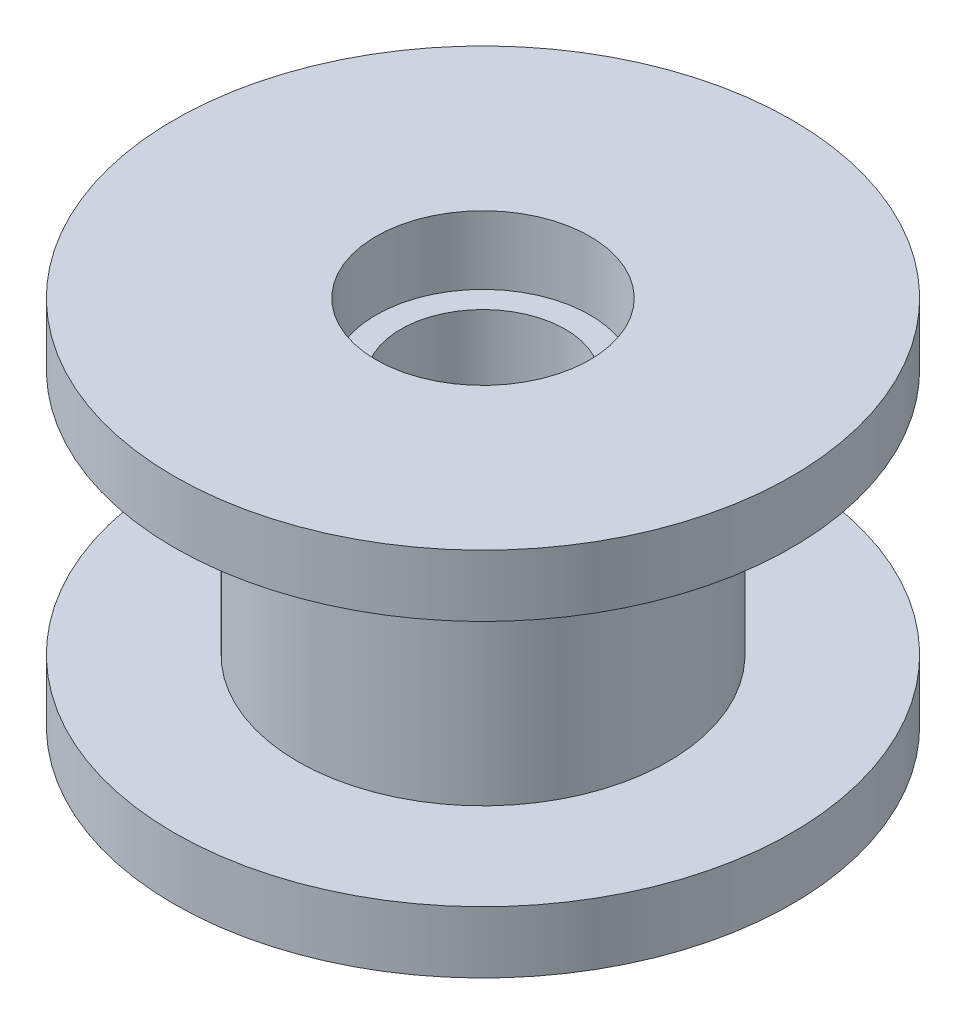
ISO-10303-21;
HEADER;
FILE_DESCRIPTION(('STEP AP214'),'2;1');
FILE_NAME('part.step','',(''),(''),'','','');
FILE_SCHEMA(('AUTOMOTIVE_DESIGN { 1 0 10303 214 1 1 1 1 }'));
ENDSEC;
DATA;
#1=APPLICATION_CONTEXT('core data for automotive mechanical design processes');
#2=APPLICATION_PROTOCOL_DEFINITION('international standard','automotive_design',2000,#1);
#3=PRODUCT_CONTEXT('',#1,'mechanical');
#4=PRODUCT('Part','Part','',(#3));
#5=PRODUCT_RELATED_PRODUCT_CATEGORY('part','',(#4));
#6=PRODUCT_DEFINITION_FORMATION('','',#4);
#7=PRODUCT_DEFINITION_CONTEXT('part definition',#1,'design');
#8=PRODUCT_DEFINITION('design','',#6,#7);
#9=PRODUCT_DEFINITION_SHAPE('','',#8);
#10=(LENGTH_UNIT() NAMED_UNIT(*) SI_UNIT(.MILLI.,.METRE.));
#11=(NAMED_UNIT(*) PLANE_ANGLE_UNIT() SI_UNIT($,.RADIAN.));
#12=(NAMED_UNIT(*) SI_UNIT($,.STERADIAN.) SOLID_ANGLE_UNIT());
#13=UNCERTAINTY_MEASURE_WITH_UNIT(LENGTH_MEASURE(1.E-05),#10,'distance_accuracy_value','');
#14=(GEOMETRIC_REPRESENTATION_CONTEXT(3) GLOBAL_UNCERTAINTY_ASSIGNED_CONTEXT((#13)) GLOBAL_UNIT_ASSIGNED_CONTEXT((#10,
#11,#12)) REPRESENTATION_CONTEXT('',''));
#15=CARTESIAN_POINT('',(0.,0.,0.));
#16=DIRECTION('',(0.,0.,1.));
#17=DIRECTION('',(1.,0.,0.));
#18=AXIS2_PLACEMENT_3D('',#15,#16,#17);
#19=CARTESIAN_POINT('',(0.,-19.05,0.));
#20=DIRECTION('',(0.,1.,0.));
#21=DIRECTION('',(0.,0.,1.));
#22=AXIS2_PLACEMENT_3D('',#19,#20,#21);
#23=CYLINDRICAL_SURFACE('',#22,11.);
#24=CARTESIAN_POINT('',(0.,-19.05,0.));
#25=DIRECTION('',(0.,1.,0.));
#26=DIRECTION('',(0.,0.,1.));
#27=AXIS2_PLACEMENT_3D('',#24,#25,#26);
#28=CIRCLE('',#27,11.);
#29=CARTESIAN_POINT('',(0.,-19.05,11.));
#30=VERTEX_POINT('',#29);
#31=EDGE_CURVE('E88',#30,#30,#28,.T.);
#32=CARTESIAN_POINT('',(0.,-12.05,0.));
#33=DIRECTION('',(0.,1.,0.));
#34=DIRECTION('',(0.,0.,1.));
#35=AXIS2_PLACEMENT_3D('',#32,#33,#34);
#36=CIRCLE('',#35,11.);
#37=CARTESIAN_POINT('',(0.,-12.05,11.));
#38=VERTEX_POINT('',#37);
#39=EDGE_CURVE('E11',#38,#38,#36,.F.);
#40=CARTESIAN_POINT('',(0.,-19.05,11.));
#41=CARTESIAN_POINT('',(0.,-18.9770833333333,11.));
#42=CARTESIAN_POINT('',(0.,-18.9041666666667,11.));
#43=CARTESIAN_POINT('',(0.,-18.7583333333333,11.));
#44=CARTESIAN_POINT('',(0.,-18.6854166666667,11.));
#45=CARTESIAN_POINT('',(0.,-18.5395833333333,11.));
#46=CARTESIAN_POINT('',(0.,-18.4666666666667,11.));
#47=CARTESIAN_POINT('',(0.,-18.3208333333333,11.));
#48=CARTESIAN_POINT('',(0.,-18.2479166666667,11.));
#49=CARTESIAN_POINT('',(0.,-18.1020833333333,11.));
#50=CARTESIAN_POINT('',(0.,-18.0291666666667,11.));
#51=CARTESIAN_POINT('',(0.,-17.8833333333333,11.));
#52=CARTESIAN_POINT('',(0.,-17.8104166666667,11.));
#53=CARTESIAN_POINT('',(0.,-17.6645833333333,11.));
#54=CARTESIAN_POINT('',(0.,-17.5916666666667,11.));
#55=CARTESIAN_POINT('',(0.,-17.4458333333333,11.));
#56=CARTESIAN_POINT('',(0.,-17.3729166666667,11.));
#57=CARTESIAN_POINT('',(0.,-17.2270833333333,11.));
#58=CARTESIAN_POINT('',(0.,-17.1541666666667,11.));
#59=CARTESIAN_POINT('',(0.,-17.0083333333333,11.));
#60=CARTESIAN_POINT('',(0.,-16.9354166666667,11.));
#61=CARTESIAN_POINT('',(0.,-16.7895833333333,11.));
#62=CARTESIAN_POINT('',(0.,-16.7166666666667,11.));
#63=CARTESIAN_POINT('',(0.,-16.5708333333333,11.));
#64=CARTESIAN_POINT('',(0.,-16.4979166666667,11.));
#65=CARTESIAN_POINT('',(0.,-16.3520833333333,11.));
#66=CARTESIAN_POINT('',(0.,-16.2791666666667,11.));
#67=CARTESIAN_POINT('',(0.,-16.1333333333333,11.));
#68=CARTESIAN_POINT('',(0.,-16.0604166666667,11.));
#69=CARTESIAN_POINT('',(0.,-15.9145833333333,11.));
#70=CARTESIAN_POINT('',(0.,-15.8416666666667,11.));
#71=CARTESIAN_POINT('',(0.,-15.6958333333333,11.));
#72=CARTESIAN_POINT('',(0.,-15.6229166666667,11.));
#73=CARTESIAN_POINT('',(0.,-15.4770833333333,11.));
#74=CARTESIAN_POINT('',(0.,-15.4041666666667,11.));
#75=CARTESIAN_POINT('',(0.,-15.2583333333333,11.));
#76=CARTESIAN_POINT('',(0.,-15.1854166666667,11.));
#77=CARTESIAN_POINT('',(0.,-15.0395833333333,11.));
#78=CARTESIAN_POINT('',(0.,-14.9666666666667,11.));
#79=CARTESIAN_POINT('',(0.,-14.8208333333333,11.));
#80=CARTESIAN_POINT('',(0.,-14.7479166666667,11.));
#81=CARTESIAN_POINT('',(0.,-14.6020833333333,11.));
#82=CARTESIAN_POINT('',(0.,-14.5291666666667,11.));
#83=CARTESIAN_POINT('',(0.,-14.3833333333333,11.));
#84=CARTESIAN_POINT('',(0.,-14.3104166666667,11.));
#85=CARTESIAN_POINT('',(0.,-14.1645833333333,11.));
#86=CARTESIAN_POINT('',(0.,-14.0916666666667,11.));
#87=CARTESIAN_POINT('',(0.,-13.9458333333333,11.));
#88=CARTESIAN_POINT('',(0.,-13.8729166666667,11.));
#89=CARTESIAN_POINT('',(0.,-13.7270833333333,11.));
#90=CARTESIAN_POINT('',(0.,-13.6541666666667,11.));
#91=CARTESIAN_POINT('',(0.,-13.5083333333333,11.));
#92=CARTESIAN_POINT('',(0.,-13.4354166666667,11.));
#93=CARTESIAN_POINT('',(0.,-13.2895833333333,11.));
#94=CARTESIAN_POINT('',(0.,-13.2166666666667,11.));
#95=CARTESIAN_POINT('',(0.,-13.0708333333333,11.));
#96=CARTESIAN_POINT('',(0.,-12.9979166666667,11.));
#97=CARTESIAN_POINT('',(0.,-12.8520833333333,11.));
#98=CARTESIAN_POINT('',(0.,-12.7791666666667,11.));
#99=CARTESIAN_POINT('',(0.,-12.6333333333333,11.));
#100=CARTESIAN_POINT('',(0.,-12.5604166666667,11.));
#101=CARTESIAN_POINT('',(0.,-12.4145833333333,11.));
#102=CARTESIAN_POINT('',(0.,-12.3416666666667,11.));
#103=CARTESIAN_POINT('',(0.,-12.1958333333333,11.));
#104=CARTESIAN_POINT('',(0.,-12.1229166666667,11.));
#105=CARTESIAN_POINT('',(0.,-12.05,11.));
#106=B_SPLINE_CURVE_WITH_KNOTS('',3,(#40,#41,#42,#43,#44,#45,#46,#47,#48,#49,#50,#51,#52,#53,
#54,#55,#56,#57,#58,#59,#60,#61,#62,#63,#64,#65,#66,#67,#68,#69,#70,#71,#72,#73,#74,#75,#76,#77,
#78,#79,#80,#81,#82,#83,#84,#85,#86,#87,#88,#89,#90,#91,#92,#93,#94,#95,#96,#97,#98,#99,#100,
#101,#102,#103,#104,#105),.UNSPECIFIED.,.F.,.F.,(4,2,2,2,2,2,2,2,2,2,2,2,2,2,2,2,2,2,2,2,2,2,2,
2,2,2,2,2,2,2,2,2,4),(0.,0.218749999999997,0.437499999999997,0.656249999999997,
0.874999999999997,1.09375,1.3125,1.53125,1.75,1.96875,2.1875,2.40625,2.625,2.84375,3.0625,
3.28125,3.5,3.71875,3.9375,4.15625,4.375,4.59375,4.8125,5.03125,5.25,5.46875,5.6875,5.90625,
6.125,6.34375,6.5625,6.78125,7.),.UNSPECIFIED.);
#107=EDGE_CURVE('BSEAM55',#30,#38,#106,.T.);
#108=ORIENTED_EDGE('',*,*,#31,.F.);
#109=ORIENTED_EDGE('',*,*,#39,.F.);
#110=ORIENTED_EDGE('',*,*,#107,.T.);
#111=ORIENTED_EDGE('',*,*,#107,.F.);
#112=EDGE_LOOP('',(#108,#110,#109,#111));
#113=FACE_BOUND('',#112,.T.);
#114=ADVANCED_FACE('F55',(#113),#23,.F.);
#115=CARTESIAN_POINT('',(0.,19.05,0.));
#116=DIRECTION('',(0.,-1.,0.));
#117=DIRECTION('',(0.,0.,-1.));
#118=AXIS2_PLACEMENT_3D('',#115,#116,#117);
#119=CYLINDRICAL_SURFACE('',#118,31.75);
#120=CARTESIAN_POINT('',(0.,-19.05,0.));
#121=DIRECTION('',(0.,1.,0.));
#122=DIRECTION('',(0.,0.,1.));
#123=AXIS2_PLACEMENT_3D('',#120,#121,#122);
#124=CIRCLE('',#123,31.75);
#125=CARTESIAN_POINT('',(0.,-19.05,-31.75));
#126=VERTEX_POINT('',#125);
#127=EDGE_CURVE('E68',#126,#126,#124,.T.);
#128=CARTESIAN_POINT('',(0.,-12.7,0.));
#129=DIRECTION('',(0.,1.,0.));
#130=DIRECTION('',(1.,0.,0.));
#131=AXIS2_PLACEMENT_3D('',#128,#129,#130);
#132=CIRCLE('',#131,31.75);
#133=CARTESIAN_POINT('',(0.,-12.7,-31.75));
#134=VERTEX_POINT('',#133);
#135=EDGE_CURVE('E74',#134,#134,#132,.T.);
#136=CARTESIAN_POINT('',(0.,-19.05,-31.75));
#137=CARTESIAN_POINT('',(0.,-18.9838541666667,-31.75));
#138=CARTESIAN_POINT('',(0.,-18.9177083333333,-31.75));
#139=CARTESIAN_POINT('',(0.,-18.7854166666667,-31.75));
#140=CARTESIAN_POINT('',(0.,-18.7192708333333,-31.75));
#141=CARTESIAN_POINT('',(0.,-18.5869791666667,-31.75));
#142=CARTESIAN_POINT('',(0.,-18.5208333333333,-31.75));
#143=CARTESIAN_POINT('',(0.,-18.3885416666667,-31.75));
#144=CARTESIAN_POINT('',(0.,-18.3223958333333,-31.75));
#145=CARTESIAN_POINT('',(0.,-18.1901041666667,-31.75));
#146=CARTESIAN_POINT('',(0.,-18.1239583333333,-31.75));
#147=CARTESIAN_POINT('',(0.,-17.9916666666667,-31.75));
#148=CARTESIAN_POINT('',(0.,-17.9255208333333,-31.75));
#149=CARTESIAN_POINT('',(0.,-17.7932291666667,-31.75));
#150=CARTESIAN_POINT('',(0.,-17.7270833333333,-31.75));
#151=CARTESIAN_POINT('',(0.,-17.5947916666667,-31.75));
#152=CARTESIAN_POINT('',(0.,-17.5286458333333,-31.75));
#153=CARTESIAN_POINT('',(0.,-17.3963541666667,-31.75));
#154=CARTESIAN_POINT('',(0.,-17.3302083333333,-31.75));
#155=CARTESIAN_POINT('',(0.,-17.1979166666667,-31.75));
#156=CARTESIAN_POINT('',(0.,-17.1317708333333,-31.75));
#157=CARTESIAN_POINT('',(0.,-16.9994791666667,-31.75));
#158=CARTESIAN_POINT('',(0.,-16.9333333333333,-31.75));
#159=CARTESIAN_POINT('',(0.,-16.8010416666667,-31.75));
#160=CARTESIAN_POINT('',(0.,-16.7348958333333,-31.75));
#161=CARTESIAN_POINT('',(0.,-16.6026041666667,-31.75));
#162=CARTESIAN_POINT('',(0.,-16.5364583333333,-31.75));
#163=CARTESIAN_POINT('',(0.,-16.4041666666667,-31.75));
#164=CARTESIAN_POINT('',(0.,-16.3380208333333,-31.75));
#165=CARTESIAN_POINT('',(0.,-16.2057291666667,-31.75));
#166=CARTESIAN_POINT('',(0.,-16.1395833333333,-31.75));
#167=CARTESIAN_POINT('',(0.,-16.0072916666667,-31.75));
#168=CARTESIAN_POINT('',(0.,-15.9411458333333,-31.75));
#169=CARTESIAN_POINT('',(0.,-15.8088541666667,-31.75));
#170=CARTESIAN_POINT('',(0.,-15.7427083333333,-31.75));
#171=CARTESIAN_POINT('',(0.,-15.6104166666667,-31.75));
#172=CARTESIAN_POINT('',(0.,-15.5442708333333,-31.75));
#173=CARTESIAN_POINT('',(0.,-15.4119791666667,-31.75));
#174=CARTESIAN_POINT('',(0.,-15.3458333333333,-31.75));
#175=CARTESIAN_POINT('',(0.,-15.2135416666667,-31.75));
#176=CARTESIAN_POINT('',(0.,-15.1473958333333,-31.75));
#177=CARTESIAN_POINT('',(0.,-15.0151041666667,-31.75));
#178=CARTESIAN_POINT('',(0.,-14.9489583333333,-31.75));
#179=CARTESIAN_POINT('',(0.,-14.8166666666667,-31.75));
#180=CARTESIAN_POINT('',(0.,-14.7505208333333,-31.75));
#181=CARTESIAN_POINT('',(0.,-14.6182291666667,-31.75));
#182=CARTESIAN_POINT('',(0.,-14.5520833333333,-31.75));
#183=CARTESIAN_POINT('',(0.,-14.4197916666667,-31.75));
#184=CARTESIAN_POINT('',(0.,-14.3536458333333,-31.75));
#185=CARTESIAN_POINT('',(0.,-14.2213541666667,-31.75));
#186=CARTESIAN_POINT('',(0.,-14.1552083333333,-31.75));
#187=CARTESIAN_POINT('',(0.,-14.0229166666667,-31.75));
#188=CARTESIAN_POINT('',(0.,-13.9567708333333,-31.75));
#189=CARTESIAN_POINT('',(0.,-13.8244791666667,-31.75));
#190=CARTESIAN_POINT('',(0.,-13.7583333333333,-31.75));
#191=CARTESIAN_POINT('',(0.,-13.6260416666667,-31.75));
#192=CARTESIAN_POINT('',(0.,-13.5598958333333,-31.75));
#193=CARTESIAN_POINT('',(0.,-13.4276041666667,-31.75));
#194=CARTESIAN_POINT('',(0.,-13.3614583333333,-31.75));
#195=CARTESIAN_POINT('',(0.,-13.2291666666667,-31.75));
#196=CARTESIAN_POINT('',(0.,-13.1630208333333,-31.75));
#197=CARTESIAN_POINT('',(0.,-13.0307291666667,-31.75));
#198=CARTESIAN_POINT('',(0.,-12.9645833333333,-31.75));
#199=CARTESIAN_POINT('',(0.,-12.8322916666667,-31.75));
#200=CARTESIAN_POINT('',(0.,-12.7661458333333,-31.75));
#201=CARTESIAN_POINT('',(0.,-12.7,-31.75));
#202=B_SPLINE_CURVE_WITH_KNOTS('',3,(#136,#137,#138,#139,#140,#141,#142,#143,#144,#145,#146,
#147,#148,#149,#150,#151,#152,#153,#154,#155,#156,#157,#158,#159,#160,#161,#162,#163,#164,#165,
#166,#167,#168,#169,#170,#171,#172,#173,#174,#175,#176,#177,#178,#179,#180,#181,#182,#183,#184,
#185,#186,#187,#188,#189,#190,#191,#192,#193,#194,#195,#196,#197,#198,#199,#200,#201),
.UNSPECIFIED.,.F.,.F.,(4,2,2,2,2,2,2,2,2,2,2,2,2,2,2,2,2,2,2,2,2,2,2,2,2,2,2,2,2,2,2,2,4),(0.,
0.198437500000002,0.396874999999998,0.5953125,0.793749999999996,0.992187499999998,1.190625,
1.3890625,1.5875,1.7859375,1.984375,2.1828125,2.38125,2.5796875,2.778125,2.97656249999999,3.175,
3.3734375,3.571875,3.7703125,3.96874999999999,4.1671875,4.365625,4.56406249999999,4.7625,
4.9609375,5.15937499999999,5.3578125,5.55625,5.75468749999999,5.953125,6.15156249999999,
6.34999999999999),.UNSPECIFIED.);
#203=EDGE_CURVE('BSEAM130',#126,#134,#202,.T.);
#204=ORIENTED_EDGE('',*,*,#127,.T.);
#205=ORIENTED_EDGE('',*,*,#135,.F.);
#206=ORIENTED_EDGE('',*,*,#203,.T.);
#207=ORIENTED_EDGE('',*,*,#203,.F.);
#208=EDGE_LOOP('',(#204,#206,#205,#207));
#209=FACE_BOUND('',#208,.T.);
#210=ADVANCED_FACE('F130',(#209),#119,.T.);
#211=CARTESIAN_POINT('',(0.,-19.05,0.));
#212=DIRECTION('',(0.,1.,0.));
#213=DIRECTION('',(0.,0.,1.));
#214=AXIS2_PLACEMENT_3D('',#211,#212,#213);
#215=PLANE('',#214);
#216=ORIENTED_EDGE('',*,*,#31,.T.);
#217=EDGE_LOOP('',(#216));
#218=FACE_BOUND('',#217,.T.);
#219=ORIENTED_EDGE('',*,*,#127,.F.);
#220=EDGE_LOOP('',(#219));
#221=FACE_BOUND('',#220,.T.);
#222=ADVANCED_FACE('F136',(#218,#221),#215,.F.);
#223=CARTESIAN_POINT('',(0.,-12.7,0.));
#224=DIRECTION('',(0.,1.,0.));
#225=DIRECTION('',(0.,0.,1.));
#226=AXIS2_PLACEMENT_3D('',#223,#224,#225);
#227=PLANE('',#226);
#228=CARTESIAN_POINT('',(0.,-12.7,0.));
#229=DIRECTION('',(0.,1.,0.));
#230=DIRECTION('',(0.,0.,1.));
#231=AXIS2_PLACEMENT_3D('',#228,#229,#230);
#232=CIRCLE('',#231,19.05);
#233=CARTESIAN_POINT('',(0.,-12.7,19.05));
#234=VERTEX_POINT('',#233);
#235=EDGE_CURVE('E80',#234,#234,#232,.T.);
#236=ORIENTED_EDGE('',*,*,#235,.F.);
#237=EDGE_LOOP('',(#236));
#238=FACE_BOUND('',#237,.T.);
#239=ORIENTED_EDGE('',*,*,#135,.T.);
#240=EDGE_LOOP('',(#239));
#241=FACE_BOUND('',#240,.T.);
#242=ADVANCED_FACE('F147',(#238,#241),#227,.T.);
#243=CARTESIAN_POINT('',(0.,12.7,0.));
#244=DIRECTION('',(0.,1.,0.));
#245=DIRECTION('',(0.,0.,1.));
#246=AXIS2_PLACEMENT_3D('',#243,#244,#245);
#247=PLANE('',#246);
#248=CARTESIAN_POINT('',(0.,12.7,0.));
#249=DIRECTION('',(0.,1.,0.));
#250=DIRECTION('',(0.,0.,1.));
#251=AXIS2_PLACEMENT_3D('',#248,#249,#250);
#252=CIRCLE('',#251,19.05);
#253=CARTESIAN_POINT('',(0.,12.7,19.05));
#254=VERTEX_POINT('',#253);
#255=EDGE_CURVE('E84',#254,#254,#252,.T.);
#256=ORIENTED_EDGE('',*,*,#255,.T.);
#257=EDGE_LOOP('',(#256));
#258=FACE_BOUND('',#257,.T.);
#259=CARTESIAN_POINT('',(0.,12.7,0.));
#260=DIRECTION('',(0.,1.,0.));
#261=DIRECTION('',(1.,0.,0.));
#262=AXIS2_PLACEMENT_3D('',#259,#260,#261);
#263=CIRCLE('',#262,31.75);
#264=CARTESIAN_POINT('',(0.,12.7,-31.75));
#265=VERTEX_POINT('',#264);
#266=EDGE_CURVE('E76',#265,#265,#263,.T.);
#267=ORIENTED_EDGE('',*,*,#266,.F.);
#268=EDGE_LOOP('',(#267));
#269=FACE_BOUND('',#268,.T.);
#270=ADVANCED_FACE('F145',(#258,#269),#247,.F.);
#271=CARTESIAN_POINT('',(0.,-12.7,0.));
#272=DIRECTION('',(0.,1.,0.));
#273=DIRECTION('',(0.,0.,1.));
#274=AXIS2_PLACEMENT_3D('',#271,#272,#273);
#275=CYLINDRICAL_SURFACE('',#274,19.05);
#276=ORIENTED_EDGE('',*,*,#235,.T.);
#277=EDGE_LOOP('',(#276));
#278=FACE_BOUND('',#277,.T.);
#279=ORIENTED_EDGE('',*,*,#255,.F.);
#280=EDGE_LOOP('',(#279));
#281=FACE_BOUND('',#280,.T.);
#282=ADVANCED_FACE('F141',(#278,#281),#275,.T.);
#283=CARTESIAN_POINT('',(0.,19.05,0.));
#284=DIRECTION('',(0.,1.,0.));
#285=DIRECTION('',(0.,0.,1.));
#286=AXIS2_PLACEMENT_3D('',#283,#284,#285);
#287=PLANE('',#286);
#288=CARTESIAN_POINT('',(0.,19.05,0.));
#289=DIRECTION('',(0.,1.,0.));
#290=DIRECTION('',(0.,0.,1.));
#291=AXIS2_PLACEMENT_3D('',#288,#289,#290);
#292=CIRCLE('',#291,11.);
#293=CARTESIAN_POINT('',(0.,19.05,11.));
#294=VERTEX_POINT('',#293);
#295=EDGE_CURVE('E95',#294,#294,#292,.T.);
#296=ORIENTED_EDGE('',*,*,#295,.F.);
#297=EDGE_LOOP('',(#296));
#298=FACE_BOUND('',#297,.T.);
#299=CARTESIAN_POINT('',(0.,19.05,0.));
#300=DIRECTION('',(0.,1.,0.));
#301=DIRECTION('',(0.,0.,1.));
#302=AXIS2_PLACEMENT_3D('',#299,#300,#301);
#303=CIRCLE('',#302,31.75);
#304=CARTESIAN_POINT('',(0.,19.05,-31.75));
#305=VERTEX_POINT('',#304);
#306=EDGE_CURVE('E63',#305,#305,#303,.T.);
#307=ORIENTED_EDGE('',*,*,#306,.T.);
#308=EDGE_LOOP('',(#307));
#309=FACE_BOUND('',#308,.T.);
#310=ADVANCED_FACE('F144',(#298,#309),#287,.T.);
#311=CARTESIAN_POINT('',(0.,12.7,-31.75));
#312=CARTESIAN_POINT('',(0.,12.7661458333333,-31.75));
#313=CARTESIAN_POINT('',(0.,12.8322916666667,-31.75));
#314=CARTESIAN_POINT('',(0.,12.9645833333333,-31.75));
#315=CARTESIAN_POINT('',(0.,13.0307291666667,-31.75));
#316=CARTESIAN_POINT('',(0.,13.1630208333333,-31.75));
#317=CARTESIAN_POINT('',(0.,13.2291666666667,-31.75));
#318=CARTESIAN_POINT('',(0.,13.3614583333333,-31.75));
#319=CARTESIAN_POINT('',(0.,13.4276041666667,-31.75));
#320=CARTESIAN_POINT('',(0.,13.5598958333333,-31.75));
#321=CARTESIAN_POINT('',(0.,13.6260416666667,-31.75));
#322=CARTESIAN_POINT('',(0.,13.7583333333333,-31.75));
#323=CARTESIAN_POINT('',(0.,13.8244791666667,-31.75));
#324=CARTESIAN_POINT('',(0.,13.9567708333333,-31.75));
#325=CARTESIAN_POINT('',(0.,14.0229166666667,-31.75));
#326=CARTESIAN_POINT('',(0.,14.1552083333333,-31.75));
#327=CARTESIAN_POINT('',(0.,14.2213541666667,-31.75));
#328=CARTESIAN_POINT('',(0.,14.3536458333333,-31.75));
#329=CARTESIAN_POINT('',(0.,14.4197916666667,-31.75));
#330=CARTESIAN_POINT('',(0.,14.5520833333333,-31.75));
#331=CARTESIAN_POINT('',(0.,14.6182291666667,-31.75));
#332=CARTESIAN_POINT('',(0.,14.7505208333333,-31.75));
#333=CARTESIAN_POINT('',(0.,14.8166666666667,-31.75));
#334=CARTESIAN_POINT('',(0.,14.9489583333333,-31.75));
#335=CARTESIAN_POINT('',(0.,15.0151041666667,-31.75));
#336=CARTESIAN_POINT('',(0.,15.1473958333333,-31.75));
#337=CARTESIAN_POINT('',(0.,15.2135416666667,-31.75));
#338=CARTESIAN_POINT('',(0.,15.3458333333333,-31.75));
#339=CARTESIAN_POINT('',(0.,15.4119791666667,-31.75));
#340=CARTESIAN_POINT('',(0.,15.5442708333333,-31.75));
#341=CARTESIAN_POINT('',(0.,15.6104166666667,-31.75));
#342=CARTESIAN_POINT('',(0.,15.7427083333333,-31.75));
#343=CARTESIAN_POINT('',(0.,15.8088541666667,-31.75));
#344=CARTESIAN_POINT('',(0.,15.9411458333333,-31.75));
#345=CARTESIAN_POINT('',(0.,16.0072916666667,-31.75));
#346=CARTESIAN_POINT('',(0.,16.1395833333333,-31.75));
#347=CARTESIAN_POINT('',(0.,16.2057291666667,-31.75));
#348=CARTESIAN_POINT('',(0.,16.3380208333333,-31.75));
#349=CARTESIAN_POINT('',(0.,16.4041666666667,-31.75));
#350=CARTESIAN_POINT('',(0.,16.5364583333333,-31.75));
#351=CARTESIAN_POINT('',(0.,16.6026041666667,-31.75));
#352=CARTESIAN_POINT('',(0.,16.7348958333333,-31.75));
#353=CARTESIAN_POINT('',(0.,16.8010416666667,-31.75));
#354=CARTESIAN_POINT('',(0.,16.9333333333333,-31.75));
#355=CARTESIAN_POINT('',(0.,16.9994791666667,-31.75));
#356=CARTESIAN_POINT('',(0.,17.1317708333333,-31.75));
#357=CARTESIAN_POINT('',(0.,17.1979166666667,-31.75));
#358=CARTESIAN_POINT('',(0.,17.3302083333333,-31.75));
#359=CARTESIAN_POINT('',(0.,17.3963541666667,-31.75));
#360=CARTESIAN_POINT('',(0.,17.5286458333333,-31.75));
#361=CARTESIAN_POINT('',(0.,17.5947916666667,-31.75));
#362=CARTESIAN_POINT('',(0.,17.7270833333333,-31.75));
#363=CARTESIAN_POINT('',(0.,17.7932291666667,-31.75));
#364=CARTESIAN_POINT('',(0.,17.9255208333333,-31.75));
#365=CARTESIAN_POINT('',(0.,17.9916666666667,-31.75));
#366=CARTESIAN_POINT('',(0.,18.1239583333333,-31.75));
#367=CARTESIAN_POINT('',(0.,18.1901041666667,-31.75));
#368=CARTESIAN_POINT('',(0.,18.3223958333333,-31.75));
#369=CARTESIAN_POINT('',(0.,18.3885416666667,-31.75));
#370=CARTESIAN_POINT('',(0.,18.5208333333333,-31.75));
#371=CARTESIAN_POINT('',(0.,18.5869791666667,-31.75));
#372=CARTESIAN_POINT('',(0.,18.7192708333333,-31.75));
#373=CARTESIAN_POINT('',(0.,18.7854166666667,-31.75));
#374=CARTESIAN_POINT('',(0.,18.9177083333333,-31.75));
#375=CARTESIAN_POINT('',(0.,18.9838541666667,-31.75));
#376=CARTESIAN_POINT('',(0.,19.05,-31.75));
#377=B_SPLINE_CURVE_WITH_KNOTS('',3,(#311,#312,#313,#314,#315,#316,#317,#318,#319,#320,#321,
#322,#323,#324,#325,#326,#327,#328,#329,#330,#331,#332,#333,#334,#335,#336,#337,#338,#339,#340,
#341,#342,#343,#344,#345,#346,#347,#348,#349,#350,#351,#352,#353,#354,#355,#356,#357,#358,#359,
#360,#361,#362,#363,#364,#365,#366,#367,#368,#369,#370,#371,#372,#373,#374,#375,#376),
.UNSPECIFIED.,.F.,.F.,(4,2,2,2,2,2,2,2,2,2,2,2,2,2,2,2,2,2,2,2,2,2,2,2,2,2,2,2,2,2,2,2,4),(0.,
0.198437499999999,0.396874999999998,0.5953125,0.793749999999999,0.992187499999998,1.190625,
1.3890625,1.5875,1.7859375,1.984375,2.1828125,2.38125,2.5796875,2.778125,2.9765625,3.175,
3.3734375,3.571875,3.7703125,3.96875,4.1671875,4.365625,4.5640625,4.7625,4.9609375,5.159375,
5.3578125,5.55625,5.7546875,5.953125,6.1515625,6.35),.UNSPECIFIED.);
#378=EDGE_CURVE('BSEAM57',#265,#305,#377,.T.);
#379=ORIENTED_EDGE('',*,*,#266,.T.);
#380=ORIENTED_EDGE('',*,*,#306,.F.);
#381=ORIENTED_EDGE('',*,*,#378,.T.);
#382=ORIENTED_EDGE('',*,*,#378,.F.);
#383=EDGE_LOOP('',(#379,#381,#380,#382));
#384=FACE_BOUND('',#383,.T.);
#385=ADVANCED_FACE('F57',(#384),#119,.T.);
#386=CARTESIAN_POINT('',(0.,12.05,0.));
#387=DIRECTION('',(0.,1.,0.));
#388=DIRECTION('',(0.,0.,1.));
#389=AXIS2_PLACEMENT_3D('',#386,#387,#388);
#390=CIRCLE('',#389,11.);
#391=CARTESIAN_POINT('',(0.,12.05,11.));
#392=VERTEX_POINT('',#391);
#393=EDGE_CURVE('E99',#392,#392,#390,.T.);
#394=CARTESIAN_POINT('',(0.,12.05,11.));
#395=CARTESIAN_POINT('',(0.,12.1229166666667,11.));
#396=CARTESIAN_POINT('',(0.,12.1958333333333,11.));
#397=CARTESIAN_POINT('',(0.,12.3416666666667,11.));
#398=CARTESIAN_POINT('',(0.,12.4145833333333,11.));
#399=CARTESIAN_POINT('',(0.,12.5604166666667,11.));
#400=CARTESIAN_POINT('',(0.,12.6333333333333,11.));
#401=CARTESIAN_POINT('',(0.,12.7791666666667,11.));
#402=CARTESIAN_POINT('',(0.,12.8520833333333,11.));
#403=CARTESIAN_POINT('',(0.,12.9979166666667,11.));
#404=CARTESIAN_POINT('',(0.,13.0708333333333,11.));
#405=CARTESIAN_POINT('',(0.,13.2166666666667,11.));
#406=CARTESIAN_POINT('',(0.,13.2895833333333,11.));
#407=CARTESIAN_POINT('',(0.,13.4354166666667,11.));
#408=CARTESIAN_POINT('',(0.,13.5083333333333,11.));
#409=CARTESIAN_POINT('',(0.,13.6541666666667,11.));
#410=CARTESIAN_POINT('',(0.,13.7270833333333,11.));
#411=CARTESIAN_POINT('',(0.,13.8729166666667,11.));
#412=CARTESIAN_POINT('',(0.,13.9458333333333,11.));
#413=CARTESIAN_POINT('',(0.,14.0916666666667,11.));
#414=CARTESIAN_POINT('',(0.,14.1645833333333,11.));
#415=CARTESIAN_POINT('',(0.,14.3104166666667,11.));
#416=CARTESIAN_POINT('',(0.,14.3833333333333,11.));
#417=CARTESIAN_POINT('',(0.,14.5291666666667,11.));
#418=CARTESIAN_POINT('',(0.,14.6020833333333,11.));
#419=CARTESIAN_POINT('',(0.,14.7479166666667,11.));
#420=CARTESIAN_POINT('',(0.,14.8208333333333,11.));
#421=CARTESIAN_POINT('',(0.,14.9666666666667,11.));
#422=CARTESIAN_POINT('',(0.,15.0395833333333,11.));
#423=CARTESIAN_POINT('',(0.,15.1854166666667,11.));
#424=CARTESIAN_POINT('',(0.,15.2583333333333,11.));
#425=CARTESIAN_POINT('',(0.,15.4041666666667,11.));
#426=CARTESIAN_POINT('',(0.,15.4770833333333,11.));
#427=CARTESIAN_POINT('',(0.,15.6229166666667,11.));
#428=CARTESIAN_POINT('',(0.,15.6958333333333,11.));
#429=CARTESIAN_POINT('',(0.,15.8416666666667,11.));
#430=CARTESIAN_POINT('',(0.,15.9145833333333,11.));
#431=CARTESIAN_POINT('',(0.,16.0604166666667,11.));
#432=CARTESIAN_POINT('',(0.,16.1333333333333,11.));
#433=CARTESIAN_POINT('',(0.,16.2791666666667,11.));
#434=CARTESIAN_POINT('',(0.,16.3520833333333,11.));
#435=CARTESIAN_POINT('',(0.,16.4979166666667,11.));
#436=CARTESIAN_POINT('',(0.,16.5708333333333,11.));
#437=CARTESIAN_POINT('',(0.,16.7166666666667,11.));
#438=CARTESIAN_POINT('',(0.,16.7895833333333,11.));
#439=CARTESIAN_POINT('',(0.,16.9354166666667,11.));
#440=CARTESIAN_POINT('',(0.,17.0083333333333,11.));
#441=CARTESIAN_POINT('',(0.,17.1541666666667,11.));
#442=CARTESIAN_POINT('',(0.,17.2270833333333,11.));
#443=CARTESIAN_POINT('',(0.,17.3729166666667,11.));
#444=CARTESIAN_POINT('',(0.,17.4458333333333,11.));
#445=CARTESIAN_POINT('',(0.,17.5916666666667,11.));
#446=CARTESIAN_POINT('',(0.,17.6645833333333,11.));
#447=CARTESIAN_POINT('',(0.,17.8104166666667,11.));
#448=CARTESIAN_POINT('',(0.,17.8833333333333,11.));
#449=CARTESIAN_POINT('',(0.,18.0291666666667,11.));
#450=CARTESIAN_POINT('',(0.,18.1020833333333,11.));
#451=CARTESIAN_POINT('',(0.,18.2479166666667,11.));
#452=CARTESIAN_POINT('',(0.,18.3208333333333,11.));
#453=CARTESIAN_POINT('',(0.,18.4666666666667,11.));
#454=CARTESIAN_POINT('',(0.,18.5395833333333,11.));
#455=CARTESIAN_POINT('',(0.,18.6854166666667,11.));
#456=CARTESIAN_POINT('',(0.,18.7583333333333,11.));
#457=CARTESIAN_POINT('',(0.,18.9041666666667,11.));
#458=CARTESIAN_POINT('',(0.,18.9770833333333,11.));
#459=CARTESIAN_POINT('',(0.,19.05,11.));
#460=B_SPLINE_CURVE_WITH_KNOTS('',3,(#394,#395,#396,#397,#398,#399,#400,#401,#402,#403,#404,
#405,#406,#407,#408,#409,#410,#411,#412,#413,#414,#415,#416,#417,#418,#419,#420,#421,#422,#423,
#424,#425,#426,#427,#428,#429,#430,#431,#432,#433,#434,#435,#436,#437,#438,#439,#440,#441,#442,
#443,#444,#445,#446,#447,#448,#449,#450,#451,#452,#453,#454,#455,#456,#457,#458,#459),
.UNSPECIFIED.,.F.,.F.,(4,2,2,2,2,2,2,2,2,2,2,2,2,2,2,2,2,2,2,2,2,2,2,2,2,2,2,2,2,2,2,2,4),(0.,
0.21875,0.437499999999997,0.656249999999994,0.874999999999997,1.09375,1.3125,1.53124999999999,
1.75,1.96875,2.1875,2.40625,2.625,2.84375,3.0625,3.28125,3.5,3.71875,3.9375,4.15625,4.375,
4.59375,4.8125,5.03125,5.25,5.46875,5.6875,5.90625,6.125,6.34375000000001,6.5625,6.78125,7.),.UNSPECIFIED.);
#461=EDGE_CURVE('BSEAM118',#392,#294,#460,.T.);
#462=ORIENTED_EDGE('',*,*,#393,.F.);
#463=ORIENTED_EDGE('',*,*,#295,.T.);
#464=ORIENTED_EDGE('',*,*,#461,.T.);
#465=ORIENTED_EDGE('',*,*,#461,.F.);
#466=EDGE_LOOP('',(#462,#464,#463,#465));
#467=FACE_BOUND('',#466,.T.);
#468=ADVANCED_FACE('F118',(#467),#23,.F.);
#469=CARTESIAN_POINT('',(0.,12.05,0.));
#470=DIRECTION('',(0.,1.,0.));
#471=DIRECTION('',(0.,0.,1.));
#472=AXIS2_PLACEMENT_3D('',#469,#470,#471);
#473=PLANE('',#472);
#474=ORIENTED_EDGE('',*,*,#393,.T.);
#475=EDGE_LOOP('',(#474));
#476=FACE_BOUND('',#475,.T.);
#477=CARTESIAN_POINT('',(0.,12.05,0.));
#478=DIRECTION('',(0.,1.,0.));
#479=DIRECTION('',(1.,0.,0.));
#480=AXIS2_PLACEMENT_3D('',#477,#478,#479);
#481=CIRCLE('',#480,8.46);
#482=CARTESIAN_POINT('',(8.46,12.05,0.));
#483=VERTEX_POINT('',#482);
#484=EDGE_CURVE('E103',#483,#483,#481,.T.);
#485=ORIENTED_EDGE('',*,*,#484,.F.);
#486=EDGE_LOOP('',(#485));
#487=FACE_BOUND('',#486,.T.);
#488=ADVANCED_FACE('F115',(#476,#487),#473,.T.);
#489=CARTESIAN_POINT('',(0.,-12.05,0.));
#490=DIRECTION('',(0.,1.,0.));
#491=DIRECTION('',(0.,0.,1.));
#492=AXIS2_PLACEMENT_3D('',#489,#490,#491);
#493=PLANE('',#492);
#494=ORIENTED_EDGE('',*,*,#39,.T.);
#495=EDGE_LOOP('',(#494));
#496=FACE_BOUND('',#495,.T.);
#497=CARTESIAN_POINT('',(0.,-12.05,0.));
#498=DIRECTION('',(0.,1.,0.));
#499=DIRECTION('',(1.,0.,0.));
#500=AXIS2_PLACEMENT_3D('',#497,#498,#499);
#501=CIRCLE('',#500,8.46);
#502=CARTESIAN_POINT('',(8.46,-12.05,0.));
#503=VERTEX_POINT('',#502);
#504=EDGE_CURVE('E104',#503,#503,#501,.T.);
#505=ORIENTED_EDGE('',*,*,#504,.T.);
#506=EDGE_LOOP('',(#505));
#507=FACE_BOUND('',#506,.T.);
#508=ADVANCED_FACE('F117',(#496,#507),#493,.F.);
#509=CARTESIAN_POINT('',(0.,12.05,0.));
#510=DIRECTION('',(0.,-1.,0.));
#511=DIRECTION('',(0.,0.,-1.));
#512=AXIS2_PLACEMENT_3D('',#509,#510,#511);
#513=CYLINDRICAL_SURFACE('',#512,8.46);
#514=ORIENTED_EDGE('',*,*,#484,.T.);
#515=EDGE_LOOP('',(#514));
#516=FACE_BOUND('',#515,.T.);
#517=ORIENTED_EDGE('',*,*,#504,.F.);
#518=EDGE_LOOP('',(#517));
#519=FACE_BOUND('',#518,.T.);
#520=ADVANCED_FACE('F112',(#516,#519),#513,.F.);
#521=CLOSED_SHELL('',(#114,#210,#222,#242,#270,#282,#310,#385,#468,#488,#508,#520));
#522=MANIFOLD_SOLID_BREP('B2',#521);
#523=ADVANCED_BREP_SHAPE_REPRESENTATION('',(#18,#522),#14);
#524=SHAPE_DEFINITION_REPRESENTATION(#9,#523);
ENDSEC;
END-ISO-10303-21;
